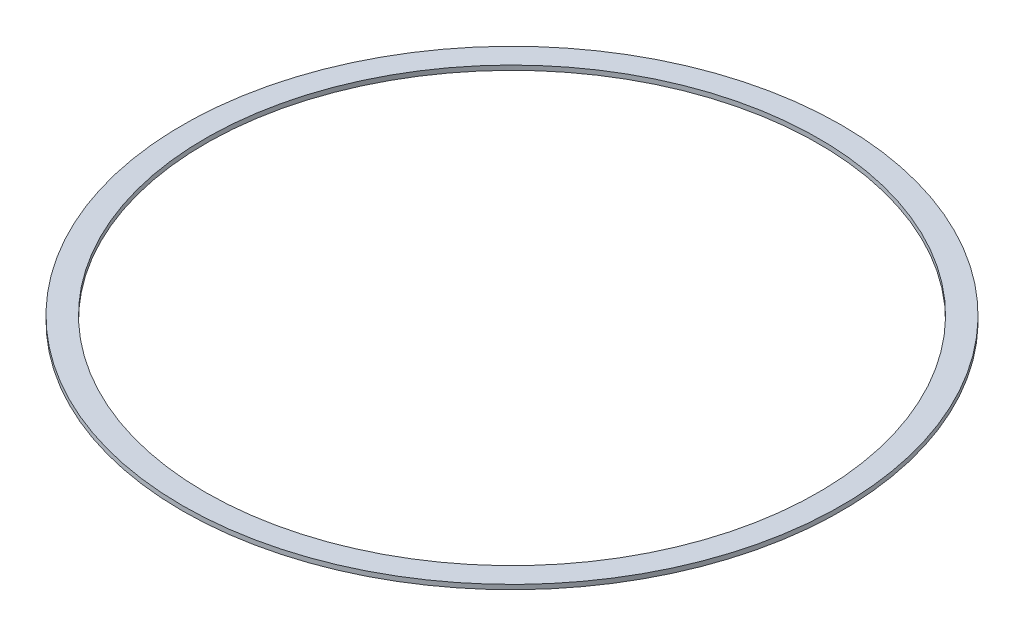
ISO-10303-21;
HEADER;
FILE_DESCRIPTION(('STEP AP214'),'2;1');
FILE_NAME('part.step','',(''),(''),'','','');
FILE_SCHEMA(('AUTOMOTIVE_DESIGN { 1 0 10303 214 1 1 1 1 }'));
ENDSEC;
DATA;
#1=APPLICATION_CONTEXT('core data for automotive mechanical design processes');
#2=APPLICATION_PROTOCOL_DEFINITION('international standard','automotive_design',2000,#1);
#3=PRODUCT_CONTEXT('',#1,'mechanical');
#4=PRODUCT('Part','Part','',(#3));
#5=PRODUCT_RELATED_PRODUCT_CATEGORY('part','',(#4));
#6=PRODUCT_DEFINITION_FORMATION('','',#4);
#7=PRODUCT_DEFINITION_CONTEXT('part definition',#1,'design');
#8=PRODUCT_DEFINITION('design','',#6,#7);
#9=PRODUCT_DEFINITION_SHAPE('','',#8);
#10=(LENGTH_UNIT() NAMED_UNIT(*) SI_UNIT(.MILLI.,.METRE.));
#11=(NAMED_UNIT(*) PLANE_ANGLE_UNIT() SI_UNIT($,.RADIAN.));
#12=(NAMED_UNIT(*) SI_UNIT($,.STERADIAN.) SOLID_ANGLE_UNIT());
#13=UNCERTAINTY_MEASURE_WITH_UNIT(LENGTH_MEASURE(1.E-05),#10,'distance_accuracy_value','');
#14=(GEOMETRIC_REPRESENTATION_CONTEXT(3) GLOBAL_UNCERTAINTY_ASSIGNED_CONTEXT((#13)) GLOBAL_UNIT_ASSIGNED_CONTEXT((#10,
#11,#12)) REPRESENTATION_CONTEXT('',''));
#15=CARTESIAN_POINT('',(0.,0.,0.));
#16=DIRECTION('',(0.,0.,1.));
#17=DIRECTION('',(1.,0.,0.));
#18=AXIS2_PLACEMENT_3D('',#15,#16,#17);
#19=CARTESIAN_POINT('',(0.,1.5,0.));
#20=DIRECTION('',(0.,1.,0.));
#21=DIRECTION('',(0.,0.,1.));
#22=AXIS2_PLACEMENT_3D('',#19,#20,#21);
#23=PLANE('',#22);
#24=CARTESIAN_POINT('',(0.,1.5,0.));
#25=DIRECTION('',(0.,1.,0.));
#26=DIRECTION('',(0.,0.,1.));
#27=AXIS2_PLACEMENT_3D('',#24,#25,#26);
#28=CIRCLE('',#27,215.);
#29=CARTESIAN_POINT('',(0.,1.5,215.));
#30=VERTEX_POINT('',#29);
#31=EDGE_CURVE('E10',#30,#30,#28,.T.);
#32=ORIENTED_EDGE('',*,*,#31,.T.);
#33=EDGE_LOOP('',(#32));
#34=FACE_BOUND('',#33,.T.);
#35=CARTESIAN_POINT('',(0.,1.5,0.));
#36=DIRECTION('',(0.,1.,0.));
#37=DIRECTION('',(0.,0.,1.));
#38=AXIS2_PLACEMENT_3D('',#35,#36,#37);
#39=CIRCLE('',#38,200.);
#40=CARTESIAN_POINT('',(0.,1.5,200.));
#41=VERTEX_POINT('',#40);
#42=EDGE_CURVE('E42',#41,#41,#39,.T.);
#43=ORIENTED_EDGE('',*,*,#42,.F.);
#44=EDGE_LOOP('',(#43));
#45=FACE_BOUND('',#44,.T.);
#46=ADVANCED_FACE('F31',(#34,#45),#23,.T.);
#47=CARTESIAN_POINT('',(0.,-1.5,0.));
#48=DIRECTION('',(0.,1.,0.));
#49=DIRECTION('',(0.,0.,1.));
#50=AXIS2_PLACEMENT_3D('',#47,#48,#49);
#51=PLANE('',#50);
#52=CARTESIAN_POINT('',(0.,-1.5,0.));
#53=DIRECTION('',(0.,1.,0.));
#54=DIRECTION('',(0.,0.,1.));
#55=AXIS2_PLACEMENT_3D('',#52,#53,#54);
#56=CIRCLE('',#55,215.);
#57=CARTESIAN_POINT('',(0.,-1.5,215.));
#58=VERTEX_POINT('',#57);
#59=EDGE_CURVE('E35',#58,#58,#56,.T.);
#60=ORIENTED_EDGE('',*,*,#59,.F.);
#61=EDGE_LOOP('',(#60));
#62=FACE_BOUND('',#61,.T.);
#63=CARTESIAN_POINT('',(0.,-1.5,0.));
#64=DIRECTION('',(0.,1.,0.));
#65=DIRECTION('',(0.,0.,1.));
#66=AXIS2_PLACEMENT_3D('',#63,#64,#65);
#67=CIRCLE('',#66,200.);
#68=CARTESIAN_POINT('',(0.,-1.5,200.));
#69=VERTEX_POINT('',#68);
#70=EDGE_CURVE('E44',#69,#69,#67,.T.);
#71=ORIENTED_EDGE('',*,*,#70,.T.);
#72=EDGE_LOOP('',(#71));
#73=FACE_BOUND('',#72,.T.);
#74=ADVANCED_FACE('F54',(#62,#73),#51,.F.);
#75=CARTESIAN_POINT('',(0.,1.5,0.));
#76=DIRECTION('',(0.,-1.,0.));
#77=DIRECTION('',(0.,0.,-1.));
#78=AXIS2_PLACEMENT_3D('',#75,#76,#77);
#79=CYLINDRICAL_SURFACE('',#78,215.);
#80=ORIENTED_EDGE('',*,*,#31,.F.);
#81=EDGE_LOOP('',(#80));
#82=FACE_BOUND('',#81,.T.);
#83=ORIENTED_EDGE('',*,*,#59,.T.);
#84=EDGE_LOOP('',(#83));
#85=FACE_BOUND('',#84,.T.);
#86=ADVANCED_FACE('F33',(#82,#85),#79,.T.);
#87=CARTESIAN_POINT('',(0.,1.5,0.));
#88=DIRECTION('',(0.,-1.,0.));
#89=DIRECTION('',(0.,0.,-1.));
#90=AXIS2_PLACEMENT_3D('',#87,#88,#89);
#91=CYLINDRICAL_SURFACE('',#90,200.);
#92=ORIENTED_EDGE('',*,*,#42,.T.);
#93=EDGE_LOOP('',(#92));
#94=FACE_BOUND('',#93,.T.);
#95=ORIENTED_EDGE('',*,*,#70,.F.);
#96=EDGE_LOOP('',(#95));
#97=FACE_BOUND('',#96,.T.);
#98=ADVANCED_FACE('F50',(#94,#97),#91,.F.);
#99=CLOSED_SHELL('',(#46,#74,#86,#98));
#100=MANIFOLD_SOLID_BREP('B2',#99);
#101=ADVANCED_BREP_SHAPE_REPRESENTATION('',(#18,#100),#14);
#102=SHAPE_DEFINITION_REPRESENTATION(#9,#101);
ENDSEC;
END-ISO-10303-21;
